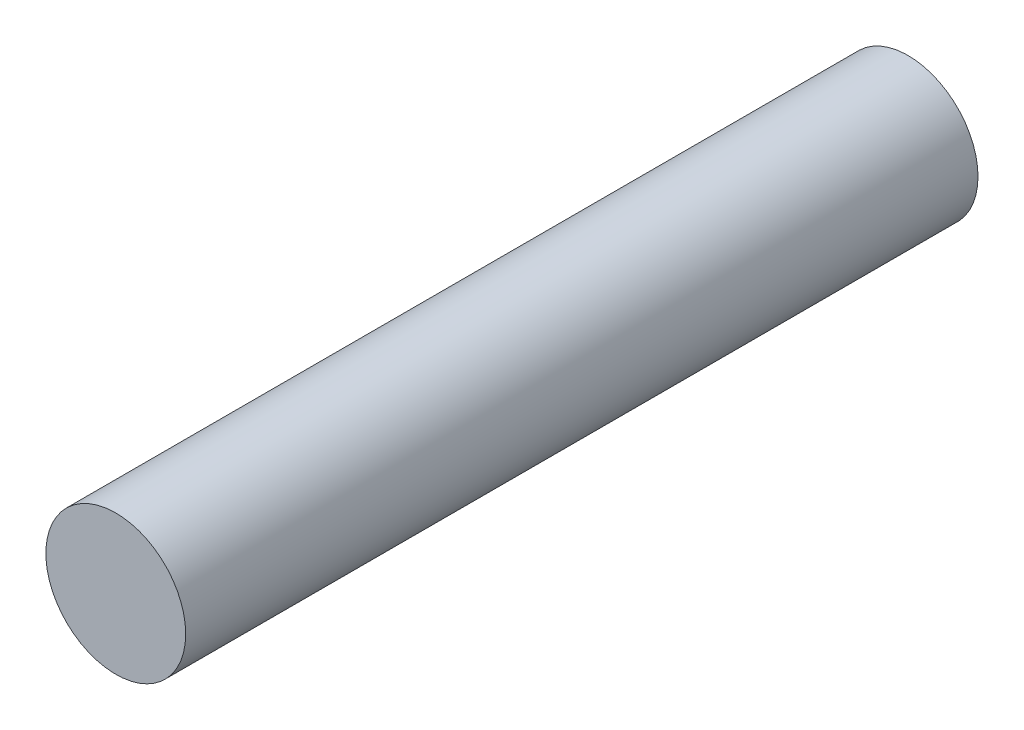
ISO-10303-21;
HEADER;
FILE_DESCRIPTION(('STEP AP214'),'2;1');
FILE_NAME('part.step','',(''),(''),'','','');
FILE_SCHEMA(('AUTOMOTIVE_DESIGN { 1 0 10303 214 1 1 1 1 }'));
ENDSEC;
DATA;
#1=APPLICATION_CONTEXT('core data for automotive mechanical design processes');
#2=APPLICATION_PROTOCOL_DEFINITION('international standard','automotive_design',2000,#1);
#3=PRODUCT_CONTEXT('',#1,'mechanical');
#4=PRODUCT('Part','Part','',(#3));
#5=PRODUCT_RELATED_PRODUCT_CATEGORY('part','',(#4));
#6=PRODUCT_DEFINITION_FORMATION('','',#4);
#7=PRODUCT_DEFINITION_CONTEXT('part definition',#1,'design');
#8=PRODUCT_DEFINITION('design','',#6,#7);
#9=PRODUCT_DEFINITION_SHAPE('','',#8);
#10=(LENGTH_UNIT() NAMED_UNIT(*) SI_UNIT(.MILLI.,.METRE.));
#11=(NAMED_UNIT(*) PLANE_ANGLE_UNIT() SI_UNIT($,.RADIAN.));
#12=(NAMED_UNIT(*) SI_UNIT($,.STERADIAN.) SOLID_ANGLE_UNIT());
#13=UNCERTAINTY_MEASURE_WITH_UNIT(LENGTH_MEASURE(1.E-05),#10,'distance_accuracy_value','');
#14=(GEOMETRIC_REPRESENTATION_CONTEXT(3) GLOBAL_UNCERTAINTY_ASSIGNED_CONTEXT((#13)) GLOBAL_UNIT_ASSIGNED_CONTEXT((#10,
#11,#12)) REPRESENTATION_CONTEXT('',''));
#15=CARTESIAN_POINT('',(0.,0.,0.));
#16=DIRECTION('',(0.,0.,1.));
#17=DIRECTION('',(1.,0.,0.));
#18=AXIS2_PLACEMENT_3D('',#15,#16,#17);
#19=CARTESIAN_POINT('',(0.,0.,17.));
#20=DIRECTION('',(0.,0.,-1.));
#21=DIRECTION('',(-1.,0.,0.));
#22=AXIS2_PLACEMENT_3D('',#19,#20,#21);
#23=CYLINDRICAL_SURFACE('',#22,3.);
#24=CARTESIAN_POINT('',(0.,0.,17.));
#25=DIRECTION('',(0.,0.,1.));
#26=DIRECTION('',(1.,0.,0.));
#27=AXIS2_PLACEMENT_3D('',#24,#25,#26);
#28=CIRCLE('',#27,3.);
#29=CARTESIAN_POINT('',(3.,0.,17.));
#30=VERTEX_POINT('',#29);
#31=EDGE_CURVE('E10',#30,#30,#28,.T.);
#32=ORIENTED_EDGE('',*,*,#31,.F.);
#33=EDGE_LOOP('',(#32));
#34=FACE_BOUND('',#33,.T.);
#35=CARTESIAN_POINT('',(0.,0.,-17.));
#36=DIRECTION('',(0.,0.,1.));
#37=DIRECTION('',(1.,0.,0.));
#38=AXIS2_PLACEMENT_3D('',#35,#36,#37);
#39=CIRCLE('',#38,3.);
#40=CARTESIAN_POINT('',(3.,0.,-17.));
#41=VERTEX_POINT('',#40);
#42=EDGE_CURVE('E41',#41,#41,#39,.T.);
#43=ORIENTED_EDGE('',*,*,#42,.T.);
#44=EDGE_LOOP('',(#43));
#45=FACE_BOUND('',#44,.T.);
#46=ADVANCED_FACE('F38',(#34,#45),#23,.T.);
#47=CARTESIAN_POINT('',(0.,0.,17.));
#48=DIRECTION('',(0.,0.,1.));
#49=DIRECTION('',(1.,0.,0.));
#50=AXIS2_PLACEMENT_3D('',#47,#48,#49);
#51=PLANE('',#50);
#52=ORIENTED_EDGE('',*,*,#31,.T.);
#53=EDGE_LOOP('',(#52));
#54=FACE_BOUND('',#53,.T.);
#55=ADVANCED_FACE('F53',(#54),#51,.T.);
#56=CARTESIAN_POINT('',(0.,0.,-17.));
#57=DIRECTION('',(0.,0.,1.));
#58=DIRECTION('',(1.,0.,0.));
#59=AXIS2_PLACEMENT_3D('',#56,#57,#58);
#60=PLANE('',#59);
#61=ORIENTED_EDGE('',*,*,#42,.F.);
#62=EDGE_LOOP('',(#61));
#63=FACE_BOUND('',#62,.T.);
#64=ADVANCED_FACE('F51',(#63),#60,.F.);
#65=CLOSED_SHELL('',(#46,#55,#64));
#66=MANIFOLD_SOLID_BREP('B2',#65);
#67=ADVANCED_BREP_SHAPE_REPRESENTATION('',(#18,#66),#14);
#68=SHAPE_DEFINITION_REPRESENTATION(#9,#67);
ENDSEC;
END-ISO-10303-21;
